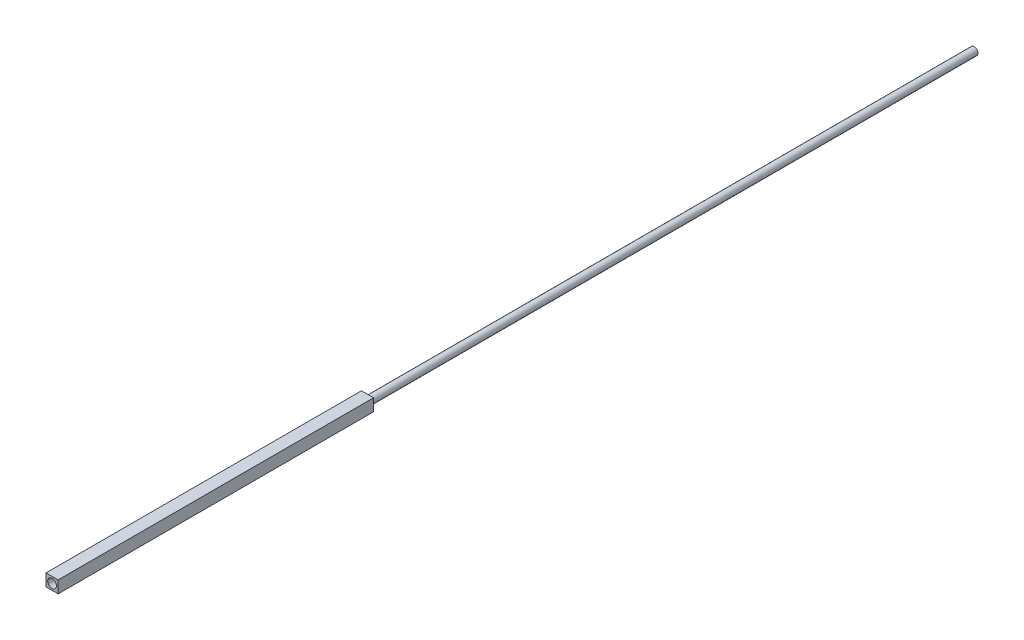
ISO-10303-21;
HEADER;
FILE_DESCRIPTION(('STEP AP214'),'2;1');
FILE_NAME('part.step','',(''),(''),'','','');
FILE_SCHEMA(('AUTOMOTIVE_DESIGN { 1 0 10303 214 1 1 1 1 }'));
ENDSEC;
DATA;
#1=APPLICATION_CONTEXT('core data for automotive mechanical design processes');
#2=APPLICATION_PROTOCOL_DEFINITION('international standard','automotive_design',2000,#1);
#3=PRODUCT_CONTEXT('',#1,'mechanical');
#4=PRODUCT('Part','Part','',(#3));
#5=PRODUCT_RELATED_PRODUCT_CATEGORY('part','',(#4));
#6=PRODUCT_DEFINITION_FORMATION('','',#4);
#7=PRODUCT_DEFINITION_CONTEXT('part definition',#1,'design');
#8=PRODUCT_DEFINITION('design','',#6,#7);
#9=PRODUCT_DEFINITION_SHAPE('','',#8);
#10=(LENGTH_UNIT() NAMED_UNIT(*) SI_UNIT(.MILLI.,.METRE.));
#11=(NAMED_UNIT(*) PLANE_ANGLE_UNIT() SI_UNIT($,.RADIAN.));
#12=(NAMED_UNIT(*) SI_UNIT($,.STERADIAN.) SOLID_ANGLE_UNIT());
#13=UNCERTAINTY_MEASURE_WITH_UNIT(LENGTH_MEASURE(1.E-05),#10,'distance_accuracy_value','');
#14=(GEOMETRIC_REPRESENTATION_CONTEXT(3) GLOBAL_UNCERTAINTY_ASSIGNED_CONTEXT((#13)) GLOBAL_UNIT_ASSIGNED_CONTEXT((#10,
#11,#12)) REPRESENTATION_CONTEXT('',''));
#15=CARTESIAN_POINT('',(0.,0.,0.));
#16=DIRECTION('',(0.,0.,1.));
#17=DIRECTION('',(1.,0.,0.));
#18=AXIS2_PLACEMENT_3D('',#15,#16,#17);
#19=CARTESIAN_POINT('',(3.175,3.175,317.5));
#20=DIRECTION('',(1.,0.,0.));
#21=DIRECTION('',(0.,1.,0.));
#22=AXIS2_PLACEMENT_3D('',#19,#20,#21);
#23=PLANE('',#22);
#24=DIRECTION('',(0.,0.,1.));
#25=VECTOR('',#24,1.);
#26=CARTESIAN_POINT('',(3.175,3.175,317.5));
#27=LINE('',#26,#25);
#28=CARTESIAN_POINT('',(3.175,3.175,317.5));
#29=VERTEX_POINT('',#28);
#30=CARTESIAN_POINT('',(3.175,3.175,482.6));
#31=VERTEX_POINT('',#30);
#32=EDGE_CURVE('E46',#29,#31,#27,.T.);
#33=ORIENTED_EDGE('',*,*,#32,.T.);
#34=DIRECTION('',(0.,1.,0.));
#35=VECTOR('',#34,1.);
#36=CARTESIAN_POINT('',(3.175,3.175,482.6));
#37=LINE('',#36,#35);
#38=CARTESIAN_POINT('',(3.175,-3.175,482.6));
#39=VERTEX_POINT('',#38);
#40=EDGE_CURVE('E83',#39,#31,#37,.T.);
#41=ORIENTED_EDGE('',*,*,#40,.F.);
#42=DIRECTION('',(0.,0.,1.));
#43=VECTOR('',#42,1.);
#44=CARTESIAN_POINT('',(3.175,-3.175,317.5));
#45=LINE('',#44,#43);
#46=CARTESIAN_POINT('',(3.175,-3.175,317.5));
#47=VERTEX_POINT('',#46);
#48=EDGE_CURVE('E12',#47,#39,#45,.T.);
#49=ORIENTED_EDGE('',*,*,#48,.F.);
#50=DIRECTION('',(0.,1.,0.));
#51=VECTOR('',#50,1.);
#52=CARTESIAN_POINT('',(3.175,3.175,317.5));
#53=LINE('',#52,#51);
#54=EDGE_CURVE('E84',#47,#29,#53,.T.);
#55=ORIENTED_EDGE('',*,*,#54,.T.);
#56=EDGE_LOOP('',(#33,#41,#49,#55));
#57=FACE_BOUND('',#56,.T.);
#58=ADVANCED_FACE('F43',(#57),#23,.T.);
#59=CARTESIAN_POINT('',(-3.175,-3.175,317.5));
#60=DIRECTION('',(0.,-1.,0.));
#61=DIRECTION('',(0.,0.,-1.));
#62=AXIS2_PLACEMENT_3D('',#59,#60,#61);
#63=PLANE('',#62);
#64=ORIENTED_EDGE('',*,*,#48,.T.);
#65=DIRECTION('',(1.,0.,0.));
#66=VECTOR('',#65,1.);
#67=CARTESIAN_POINT('',(-3.175,-3.175,482.6));
#68=LINE('',#67,#66);
#69=CARTESIAN_POINT('',(-3.175,-3.175,482.6));
#70=VERTEX_POINT('',#69);
#71=EDGE_CURVE('E101',#70,#39,#68,.T.);
#72=ORIENTED_EDGE('',*,*,#71,.F.);
#73=DIRECTION('',(0.,0.,1.));
#74=VECTOR('',#73,1.);
#75=CARTESIAN_POINT('',(-3.175,-3.175,317.5));
#76=LINE('',#75,#74);
#77=CARTESIAN_POINT('',(-3.175,-3.175,317.5));
#78=VERTEX_POINT('',#77);
#79=EDGE_CURVE('E51',#78,#70,#76,.T.);
#80=ORIENTED_EDGE('',*,*,#79,.F.);
#81=DIRECTION('',(1.,0.,0.));
#82=VECTOR('',#81,1.);
#83=CARTESIAN_POINT('',(-3.175,-3.175,317.5));
#84=LINE('',#83,#82);
#85=EDGE_CURVE('E89',#78,#47,#84,.T.);
#86=ORIENTED_EDGE('',*,*,#85,.T.);
#87=EDGE_LOOP('',(#64,#72,#80,#86));
#88=FACE_BOUND('',#87,.T.);
#89=ADVANCED_FACE('F122',(#88),#63,.T.);
#90=CARTESIAN_POINT('',(-3.175,3.175,317.5));
#91=DIRECTION('',(-1.,0.,0.));
#92=DIRECTION('',(0.,-1.,0.));
#93=AXIS2_PLACEMENT_3D('',#90,#91,#92);
#94=PLANE('',#93);
#95=ORIENTED_EDGE('',*,*,#79,.T.);
#96=DIRECTION('',(0.,-1.,0.));
#97=VECTOR('',#96,1.);
#98=CARTESIAN_POINT('',(-3.175,3.175,482.6));
#99=LINE('',#98,#97);
#100=CARTESIAN_POINT('',(-3.175,3.175,482.6));
#101=VERTEX_POINT('',#100);
#102=EDGE_CURVE('E96',#101,#70,#99,.T.);
#103=ORIENTED_EDGE('',*,*,#102,.F.);
#104=DIRECTION('',(0.,0.,1.));
#105=VECTOR('',#104,1.);
#106=CARTESIAN_POINT('',(-3.175,3.175,317.5));
#107=LINE('',#106,#105);
#108=CARTESIAN_POINT('',(-3.175,3.175,317.5));
#109=VERTEX_POINT('',#108);
#110=EDGE_CURVE('E88',#109,#101,#107,.T.);
#111=ORIENTED_EDGE('',*,*,#110,.F.);
#112=DIRECTION('',(0.,-1.,0.));
#113=VECTOR('',#112,1.);
#114=CARTESIAN_POINT('',(-3.175,3.175,317.5));
#115=LINE('',#114,#113);
#116=EDGE_CURVE('E115',#109,#78,#115,.T.);
#117=ORIENTED_EDGE('',*,*,#116,.T.);
#118=EDGE_LOOP('',(#95,#103,#111,#117));
#119=FACE_BOUND('',#118,.T.);
#120=ADVANCED_FACE('F119',(#119),#94,.T.);
#121=CARTESIAN_POINT('',(-3.175,3.175,317.5));
#122=DIRECTION('',(0.,1.,0.));
#123=DIRECTION('',(0.,0.,1.));
#124=AXIS2_PLACEMENT_3D('',#121,#122,#123);
#125=PLANE('',#124);
#126=ORIENTED_EDGE('',*,*,#110,.T.);
#127=DIRECTION('',(-1.,0.,0.));
#128=VECTOR('',#127,1.);
#129=CARTESIAN_POINT('',(-3.175,3.175,482.6));
#130=LINE('',#129,#128);
#131=EDGE_CURVE('E91',#31,#101,#130,.T.);
#132=ORIENTED_EDGE('',*,*,#131,.F.);
#133=ORIENTED_EDGE('',*,*,#32,.F.);
#134=DIRECTION('',(-1.,0.,0.));
#135=VECTOR('',#134,1.);
#136=CARTESIAN_POINT('',(-3.175,3.175,317.5));
#137=LINE('',#136,#135);
#138=EDGE_CURVE('E113',#29,#109,#137,.T.);
#139=ORIENTED_EDGE('',*,*,#138,.T.);
#140=EDGE_LOOP('',(#126,#132,#133,#139));
#141=FACE_BOUND('',#140,.T.);
#142=ADVANCED_FACE('F92',(#141),#125,.T.);
#143=CARTESIAN_POINT('',(3.175,-3.175,317.5));
#144=DIRECTION('',(0.,0.,1.));
#145=DIRECTION('',(1.,0.,0.));
#146=AXIS2_PLACEMENT_3D('',#143,#144,#145);
#147=PLANE('',#146);
#148=CARTESIAN_POINT('',(0.,0.,317.5));
#149=DIRECTION('',(0.,0.,1.));
#150=DIRECTION('',(1.,0.,0.));
#151=AXIS2_PLACEMENT_3D('',#148,#149,#150);
#152=CIRCLE('',#151,2.286);
#153=CARTESIAN_POINT('',(2.286,0.,317.5));
#154=VERTEX_POINT('',#153);
#155=EDGE_CURVE('E109',#154,#154,#152,.T.);
#156=ORIENTED_EDGE('',*,*,#155,.T.);
#157=EDGE_LOOP('',(#156));
#158=FACE_BOUND('',#157,.T.);
#159=ORIENTED_EDGE('',*,*,#54,.F.);
#160=ORIENTED_EDGE('',*,*,#85,.F.);
#161=ORIENTED_EDGE('',*,*,#116,.F.);
#162=ORIENTED_EDGE('',*,*,#138,.F.);
#163=EDGE_LOOP('',(#159,#160,#161,#162));
#164=FACE_BOUND('',#163,.T.);
#165=ADVANCED_FACE('F124',(#158,#164),#147,.F.);
#166=CARTESIAN_POINT('',(0.,0.,317.5));
#167=DIRECTION('',(0.,0.,1.));
#168=DIRECTION('',(1.,0.,0.));
#169=AXIS2_PLACEMENT_3D('',#166,#167,#168);
#170=CYLINDRICAL_SURFACE('',#169,2.286);
#171=ORIENTED_EDGE('',*,*,#155,.F.);
#172=EDGE_LOOP('',(#171));
#173=FACE_BOUND('',#172,.T.);
#174=CARTESIAN_POINT('',(0.,0.,482.6));
#175=DIRECTION('',(0.,0.,1.));
#176=DIRECTION('',(1.,0.,0.));
#177=AXIS2_PLACEMENT_3D('',#174,#175,#176);
#178=CIRCLE('',#177,2.286);
#179=CARTESIAN_POINT('',(2.286,0.,482.6));
#180=VERTEX_POINT('',#179);
#181=EDGE_CURVE('E102',#180,#180,#178,.T.);
#182=ORIENTED_EDGE('',*,*,#181,.T.);
#183=EDGE_LOOP('',(#182));
#184=FACE_BOUND('',#183,.T.);
#185=ADVANCED_FACE('F126',(#173,#184),#170,.F.);
#186=CARTESIAN_POINT('',(3.175,-3.175,482.6));
#187=DIRECTION('',(0.,0.,1.));
#188=DIRECTION('',(1.,0.,0.));
#189=AXIS2_PLACEMENT_3D('',#186,#187,#188);
#190=PLANE('',#189);
#191=ORIENTED_EDGE('',*,*,#40,.T.);
#192=ORIENTED_EDGE('',*,*,#131,.T.);
#193=ORIENTED_EDGE('',*,*,#102,.T.);
#194=ORIENTED_EDGE('',*,*,#71,.T.);
#195=EDGE_LOOP('',(#191,#192,#193,#194));
#196=FACE_BOUND('',#195,.T.);
#197=ORIENTED_EDGE('',*,*,#181,.F.);
#198=EDGE_LOOP('',(#197));
#199=FACE_BOUND('',#198,.T.);
#200=ADVANCED_FACE('F99',(#196,#199),#190,.T.);
#201=CLOSED_SHELL('',(#58,#89,#120,#142,#165,#185,#200));
#202=MANIFOLD_SOLID_BREP('B2',#201);
#203=CARTESIAN_POINT('',(0.,0.,330.2));
#204=DIRECTION('',(0.,0.,1.));
#205=DIRECTION('',(1.,0.,0.));
#206=AXIS2_PLACEMENT_3D('',#203,#204,#205);
#207=PLANE('',#206);
#208=CARTESIAN_POINT('',(0.,0.,330.2));
#209=DIRECTION('',(0.,0.,1.));
#210=DIRECTION('',(1.,0.,0.));
#211=AXIS2_PLACEMENT_3D('',#208,#209,#210);
#212=CIRCLE('',#211,1.9939);
#213=CARTESIAN_POINT('',(1.9939,0.,330.2));
#214=VERTEX_POINT('',#213);
#215=EDGE_CURVE('E260',#214,#214,#212,.T.);
#216=ORIENTED_EDGE('',*,*,#215,.T.);
#217=EDGE_LOOP('',(#216));
#218=FACE_BOUND('',#217,.T.);
#219=CARTESIAN_POINT('',(0.,0.,330.2));
#220=DIRECTION('',(0.,0.,1.));
#221=DIRECTION('',(1.,0.,0.));
#222=AXIS2_PLACEMENT_3D('',#219,#220,#221);
#223=CIRCLE('',#222,1.6939);
#224=CARTESIAN_POINT('',(1.6939,0.,330.2));
#225=VERTEX_POINT('',#224);
#226=EDGE_CURVE('E250',#225,#225,#223,.T.);
#227=ORIENTED_EDGE('',*,*,#226,.F.);
#228=EDGE_LOOP('',(#227));
#229=FACE_BOUND('',#228,.T.);
#230=ADVANCED_FACE('F188',(#218,#229),#207,.T.);
#231=CARTESIAN_POINT('',(0.,0.,0.));
#232=DIRECTION('',(0.,0.,1.));
#233=DIRECTION('',(1.,0.,0.));
#234=AXIS2_PLACEMENT_3D('',#231,#232,#233);
#235=PLANE('',#234);
#236=CARTESIAN_POINT('',(0.,0.,0.));
#237=DIRECTION('',(0.,0.,1.));
#238=DIRECTION('',(1.,0.,0.));
#239=AXIS2_PLACEMENT_3D('',#236,#237,#238);
#240=CIRCLE('',#239,1.9939);
#241=CARTESIAN_POINT('',(-1.71562851748272,-1.016,0.));
#242=VERTEX_POINT('',#241);
#243=CARTESIAN_POINT('',(-1.71562851748275,1.01599999999997,0.));
#244=VERTEX_POINT('',#243);
#245=EDGE_CURVE('E246',#242,#244,#240,.T.);
#246=ORIENTED_EDGE('',*,*,#245,.F.);
#247=DIRECTION('',(1.,0.,0.));
#248=VECTOR('',#247,1.);
#249=CARTESIAN_POINT('',(-1.9949,-1.016,0.));
#250=LINE('',#249,#248);
#251=CARTESIAN_POINT('',(-1.35537493336713,-1.016,0.));
#252=VERTEX_POINT('',#251);
#253=EDGE_CURVE('E254',#242,#252,#250,.T.);
#254=ORIENTED_EDGE('',*,*,#253,.T.);
#255=CARTESIAN_POINT('',(0.,0.,0.));
#256=DIRECTION('',(0.,0.,1.));
#257=DIRECTION('',(1.,0.,0.));
#258=AXIS2_PLACEMENT_3D('',#255,#256,#257);
#259=CIRCLE('',#258,1.6939);
#260=CARTESIAN_POINT('',(-1.35537493336717,1.01599999999997,0.));
#261=VERTEX_POINT('',#260);
#262=EDGE_CURVE('E247',#252,#261,#259,.T.);
#263=ORIENTED_EDGE('',*,*,#262,.T.);
#264=DIRECTION('',(1.,0.,0.));
#265=VECTOR('',#264,1.);
#266=CARTESIAN_POINT('',(-1.9949,1.016,0.));
#267=LINE('',#266,#265);
#268=EDGE_CURVE('E203',#244,#261,#267,.T.);
#269=ORIENTED_EDGE('',*,*,#268,.F.);
#270=EDGE_LOOP('',(#246,#254,#263,#269));
#271=FACE_BOUND('',#270,.T.);
#272=ADVANCED_FACE('F270',(#271),#235,.F.);
#273=CARTESIAN_POINT('',(0.,0.,330.2));
#274=DIRECTION('',(0.,0.,-1.));
#275=DIRECTION('',(-1.,0.,0.));
#276=AXIS2_PLACEMENT_3D('',#273,#274,#275);
#277=CYLINDRICAL_SURFACE('',#276,1.9939);
#278=ORIENTED_EDGE('',*,*,#215,.F.);
#279=EDGE_LOOP('',(#278));
#280=FACE_BOUND('',#279,.T.);
#281=CARTESIAN_POINT('',(0.,0.,2.53999999999999));
#282=DIRECTION('',(0.,0.,1.));
#283=DIRECTION('',(1.,0.,0.));
#284=AXIS2_PLACEMENT_3D('',#281,#282,#283);
#285=CIRCLE('',#284,1.9939);
#286=CARTESIAN_POINT('',(-1.71562851748273,-1.016,2.53999999999999));
#287=VERTEX_POINT('',#286);
#288=CARTESIAN_POINT('',(-1.71562851748275,1.016,2.54));
#289=VERTEX_POINT('',#288);
#290=EDGE_CURVE('E238',#287,#289,#285,.F.);
#291=ORIENTED_EDGE('',*,*,#290,.F.);
#292=DIRECTION('',(0.,0.,-1.));
#293=VECTOR('',#292,1.);
#294=CARTESIAN_POINT('',(-1.71562851748272,-1.01600000000003,330.2));
#295=LINE('',#294,#293);
#296=EDGE_CURVE('E234',#242,#287,#295,.F.);
#297=ORIENTED_EDGE('',*,*,#296,.F.);
#298=ORIENTED_EDGE('',*,*,#245,.T.);
#299=DIRECTION('',(0.,0.,-1.));
#300=VECTOR('',#299,1.);
#301=CARTESIAN_POINT('',(-1.71562851748275,1.01599999999997,330.2));
#302=LINE('',#301,#300);
#303=EDGE_CURVE('E230',#289,#244,#302,.T.);
#304=ORIENTED_EDGE('',*,*,#303,.F.);
#305=EDGE_LOOP('',(#291,#297,#298,#304));
#306=FACE_BOUND('',#305,.T.);
#307=ADVANCED_FACE('F190',(#280,#306),#277,.T.);
#308=CARTESIAN_POINT('',(0.,0.,330.2));
#309=DIRECTION('',(0.,0.,-1.));
#310=DIRECTION('',(-1.,0.,0.));
#311=AXIS2_PLACEMENT_3D('',#308,#309,#310);
#312=CYLINDRICAL_SURFACE('',#311,1.6939);
#313=DIRECTION('',(0.,0.,-1.));
#314=VECTOR('',#313,1.);
#315=CARTESIAN_POINT('',(-1.35537493336713,-1.01600000000003,330.2));
#316=LINE('',#315,#314);
#317=CARTESIAN_POINT('',(-1.35537493336715,-1.016,2.53999999999999));
#318=VERTEX_POINT('',#317);
#319=EDGE_CURVE('E41',#318,#252,#316,.T.);
#320=ORIENTED_EDGE('',*,*,#319,.F.);
#321=CARTESIAN_POINT('',(0.,0.,2.53999999999999));
#322=DIRECTION('',(0.,0.,1.));
#323=DIRECTION('',(1.,0.,0.));
#324=AXIS2_PLACEMENT_3D('',#321,#322,#323);
#325=CIRCLE('',#324,1.6939);
#326=CARTESIAN_POINT('',(-1.35537493336717,1.016,2.54));
#327=VERTEX_POINT('',#326);
#328=EDGE_CURVE('E196',#327,#318,#325,.T.);
#329=ORIENTED_EDGE('',*,*,#328,.F.);
#330=DIRECTION('',(0.,0.,-1.));
#331=VECTOR('',#330,1.);
#332=CARTESIAN_POINT('',(-1.35537493336717,1.01599999999997,330.2));
#333=LINE('',#332,#331);
#334=EDGE_CURVE('E231',#261,#327,#333,.F.);
#335=ORIENTED_EDGE('',*,*,#334,.F.);
#336=ORIENTED_EDGE('',*,*,#262,.F.);
#337=EDGE_LOOP('',(#320,#329,#335,#336));
#338=FACE_BOUND('',#337,.T.);
#339=ORIENTED_EDGE('',*,*,#226,.T.);
#340=EDGE_LOOP('',(#339));
#341=FACE_BOUND('',#340,.T.);
#342=ADVANCED_FACE('F267',(#338,#341),#312,.F.);
#343=CARTESIAN_POINT('',(-1.9949,-1.016,0.));
#344=DIRECTION('',(0.,-1.,0.));
#345=DIRECTION('',(0.,0.,-1.));
#346=AXIS2_PLACEMENT_3D('',#343,#344,#345);
#347=PLANE('',#346);
#348=ORIENTED_EDGE('',*,*,#319,.T.);
#349=ORIENTED_EDGE('',*,*,#253,.F.);
#350=ORIENTED_EDGE('',*,*,#296,.T.);
#351=DIRECTION('',(1.,0.,0.));
#352=VECTOR('',#351,1.);
#353=CARTESIAN_POINT('',(-1.9949,-1.016,2.54));
#354=LINE('',#353,#352);
#355=EDGE_CURVE('E235',#287,#318,#354,.T.);
#356=ORIENTED_EDGE('',*,*,#355,.T.);
#357=EDGE_LOOP('',(#348,#349,#350,#356));
#358=FACE_BOUND('',#357,.T.);
#359=ADVANCED_FACE('F265',(#358),#347,.F.);
#360=CARTESIAN_POINT('',(-1.9949,1.016,2.54));
#361=DIRECTION('',(0.,0.,1.));
#362=DIRECTION('',(1.,0.,0.));
#363=AXIS2_PLACEMENT_3D('',#360,#361,#362);
#364=PLANE('',#363);
#365=ORIENTED_EDGE('',*,*,#328,.T.);
#366=ORIENTED_EDGE('',*,*,#355,.F.);
#367=ORIENTED_EDGE('',*,*,#290,.T.);
#368=DIRECTION('',(1.,0.,0.));
#369=VECTOR('',#368,1.);
#370=CARTESIAN_POINT('',(-1.9949,1.016,2.54));
#371=LINE('',#370,#369);
#372=EDGE_CURVE('E226',#289,#327,#371,.T.);
#373=ORIENTED_EDGE('',*,*,#372,.T.);
#374=EDGE_LOOP('',(#365,#366,#367,#373));
#375=FACE_BOUND('',#374,.T.);
#376=ADVANCED_FACE('F239',(#375),#364,.F.);
#377=CARTESIAN_POINT('',(-1.9949,1.016,0.));
#378=DIRECTION('',(0.,1.,0.));
#379=DIRECTION('',(0.,0.,1.));
#380=AXIS2_PLACEMENT_3D('',#377,#378,#379);
#381=PLANE('',#380);
#382=ORIENTED_EDGE('',*,*,#334,.T.);
#383=ORIENTED_EDGE('',*,*,#372,.F.);
#384=ORIENTED_EDGE('',*,*,#303,.T.);
#385=ORIENTED_EDGE('',*,*,#268,.T.);
#386=EDGE_LOOP('',(#382,#383,#384,#385));
#387=FACE_BOUND('',#386,.T.);
#388=ADVANCED_FACE('F228',(#387),#381,.F.);
#389=CLOSED_SHELL('',(#230,#272,#307,#342,#359,#376,#388));
#390=MANIFOLD_SOLID_BREP('B6',#389);
#391=ADVANCED_BREP_SHAPE_REPRESENTATION('',(#18,#202,#390),#14);
#392=SHAPE_DEFINITION_REPRESENTATION(#9,#391);
ENDSEC;
END-ISO-10303-21;
